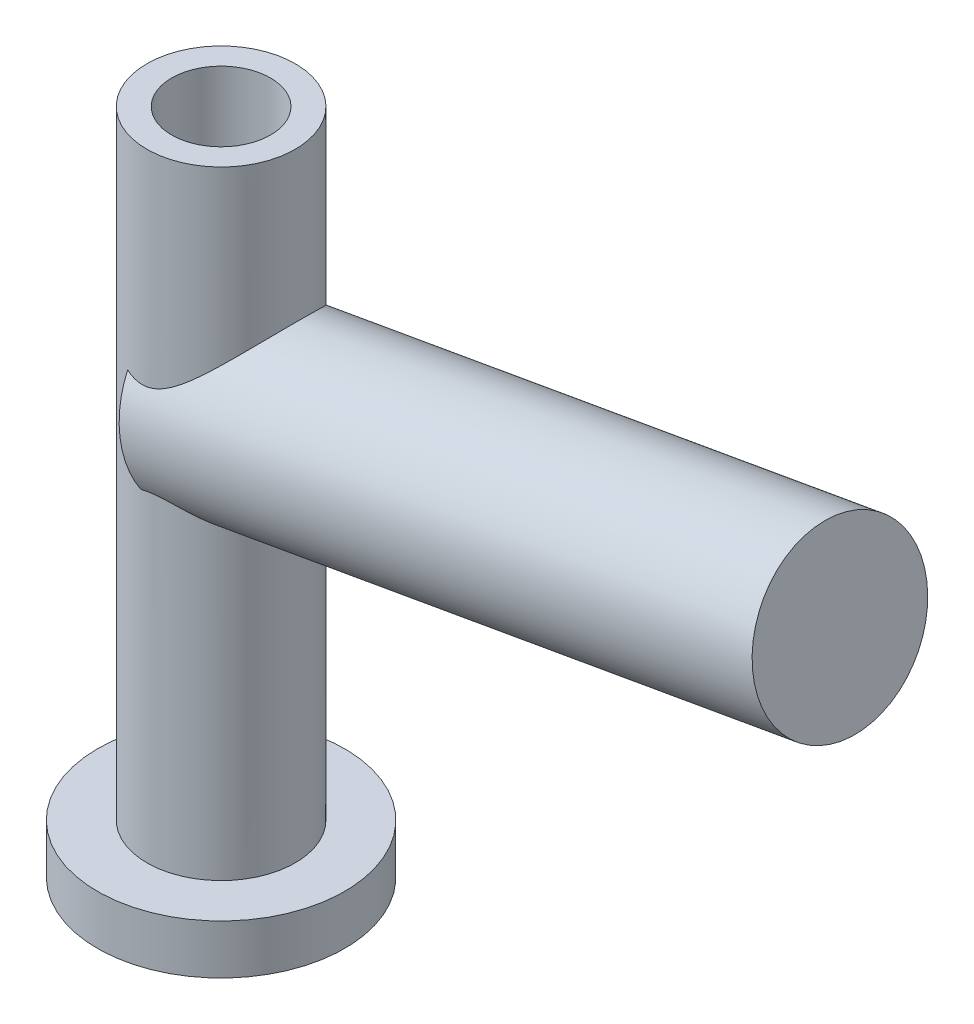
ISO-10303-21;
HEADER;
FILE_DESCRIPTION(('STEP AP214'),'2;1');
FILE_NAME('part.step','',(''),(''),'','','');
FILE_SCHEMA(('AUTOMOTIVE_DESIGN { 1 0 10303 214 1 1 1 1 }'));
ENDSEC;
DATA;
#1=APPLICATION_CONTEXT('core data for automotive mechanical design processes');
#2=APPLICATION_PROTOCOL_DEFINITION('international standard','automotive_design',2000,#1);
#3=PRODUCT_CONTEXT('',#1,'mechanical');
#4=PRODUCT('Part','Part','',(#3));
#5=PRODUCT_RELATED_PRODUCT_CATEGORY('part','',(#4));
#6=PRODUCT_DEFINITION_FORMATION('','',#4);
#7=PRODUCT_DEFINITION_CONTEXT('part definition',#1,'design');
#8=PRODUCT_DEFINITION('design','',#6,#7);
#9=PRODUCT_DEFINITION_SHAPE('','',#8);
#10=(LENGTH_UNIT() NAMED_UNIT(*) SI_UNIT(.MILLI.,.METRE.));
#11=(NAMED_UNIT(*) PLANE_ANGLE_UNIT() SI_UNIT($,.RADIAN.));
#12=(NAMED_UNIT(*) SI_UNIT($,.STERADIAN.) SOLID_ANGLE_UNIT());
#13=UNCERTAINTY_MEASURE_WITH_UNIT(LENGTH_MEASURE(1.E-05),#10,'distance_accuracy_value','');
#14=(GEOMETRIC_REPRESENTATION_CONTEXT(3) GLOBAL_UNCERTAINTY_ASSIGNED_CONTEXT((#13)) GLOBAL_UNIT_ASSIGNED_CONTEXT((#10,
#11,#12)) REPRESENTATION_CONTEXT('',''));
#15=CARTESIAN_POINT('',(0.,0.,0.));
#16=DIRECTION('',(0.,0.,1.));
#17=DIRECTION('',(1.,0.,0.));
#18=AXIS2_PLACEMENT_3D('',#15,#16,#17);
#19=CARTESIAN_POINT('',(0.,202.5,0.));
#20=DIRECTION('',(0.,1.,0.));
#21=DIRECTION('',(-1.,0.,0.));
#22=AXIS2_PLACEMENT_3D('',#19,#20,#21);
#23=CYLINDRICAL_SURFACE('',#22,45.);
#24=CARTESIAN_POINT('',(0.,-172.5,0.));
#25=DIRECTION('',(0.,1.,0.));
#26=DIRECTION('',(-1.,0.,0.));
#27=AXIS2_PLACEMENT_3D('',#24,#25,#26);
#28=CIRCLE('',#27,44.9999999999999);
#29=CARTESIAN_POINT('',(-44.9999999999999,-172.5,0.));
#30=VERTEX_POINT('',#29);
#31=EDGE_CURVE('E94',#30,#30,#28,.T.);
#32=ORIENTED_EDGE('',*,*,#31,.T.);
#33=EDGE_LOOP('',(#32));
#34=FACE_BOUND('',#33,.T.);
#35=CARTESIAN_POINT('',(0.,202.5,0.));
#36=DIRECTION('',(0.,1.,0.));
#37=DIRECTION('',(-1.,0.,0.));
#38=AXIS2_PLACEMENT_3D('',#35,#36,#37);
#39=CIRCLE('',#38,45.);
#40=CARTESIAN_POINT('',(-45.0000000000001,202.5,0.));
#41=VERTEX_POINT('',#40);
#42=EDGE_CURVE('E91',#41,#41,#39,.T.);
#43=ORIENTED_EDGE('',*,*,#42,.F.);
#44=EDGE_LOOP('',(#43));
#45=FACE_BOUND('',#44,.T.);
#46=CARTESIAN_POINT('',(0.,1.66533453693773E-13,0.));
#47=DIRECTION('',(0.984807753012208,0.173648177666931,0.));
#48=DIRECTION('',(-0.173648177666931,0.984807753012208,0.));
#49=AXIS2_PLACEMENT_3D('',#46,#47,#48);
#50=ELLIPSE('',#49,259.144671741463,45.);
#51=CARTESIAN_POINT('',(-13.8588079989624,78.5972058460888,42.8127719360455));
#52=VERTEX_POINT('',#51);
#53=CARTESIAN_POINT('',(-3.83948660651369,21.7748105881878,44.8359046144755));
#54=VERTEX_POINT('',#53);
#55=EDGE_CURVE('E11',#52,#54,#50,.T.);
#56=ORIENTED_EDGE('',*,*,#55,.F.);
#57=CARTESIAN_POINT('',(-13.8588079989624,78.5972058460888,-42.8127719360455));
#58=CARTESIAN_POINT('',(-13.5020682336849,78.494900262207,-42.928249213952));
#59=CARTESIAN_POINT('',(-13.1427838544446,78.3969039139421,-43.0396272165403));
#60=CARTESIAN_POINT('',(-12.4191677396781,78.2105091767803,-43.2539799090304));
#61=CARTESIAN_POINT('',(-12.0548349233566,78.1221128800589,-43.3569527659573));
#62=CARTESIAN_POINT('',(-10.9533860233819,77.8725920031187,-43.6531996481481));
#63=CARTESIAN_POINT('',(-10.2089635340595,77.7274697825979,-43.8334303837411));
#64=CARTESIAN_POINT('',(-8.70563043818808,77.4886584406251,-44.1565584695316));
#65=CARTESIAN_POINT('',(-7.94675649576806,77.3948534838856,-44.2995395155099));
#66=CARTESIAN_POINT('',(-6.4181033975828,77.2659595975164,-44.5466804427495));
#67=CARTESIAN_POINT('',(-5.64833170158054,77.2308322921113,-44.6508656621936));
#68=CARTESIAN_POINT('',(-4.09521830997738,77.2248373890262,-44.8201537138915));
#69=CARTESIAN_POINT('',(-3.31182211567425,77.2547095083745,-44.8847958157205));
#70=CARTESIAN_POINT('',(-1.74815759633799,77.3825180301158,-44.9728505219206));
#71=CARTESIAN_POINT('',(-0.967889715048915,77.4804637673907,-44.9962574701912));
#72=CARTESIAN_POINT('',(0.579748895131322,77.7421179422618,-45.0029055759001));
#73=CARTESIAN_POINT('',(1.34714533144246,77.9056733849828,-44.9862397304213));
#74=CARTESIAN_POINT('',(2.86472704055477,78.2928839673861,-44.9151514225604));
#75=CARTESIAN_POINT('',(3.61490985278453,78.5165476417603,-44.8607235966651));
#76=CARTESIAN_POINT('',(5.25874134194113,79.0717667837323,-44.7009072026467));
#77=CARTESIAN_POINT('',(6.1471593020175,79.4162560012047,-44.5868725427947));
#78=CARTESIAN_POINT('',(7.88940476648677,80.1678337010514,-44.3118050051057));
#79=CARTESIAN_POINT('',(8.74321987942773,80.5749443625335,-44.150755457436));
#80=CARTESIAN_POINT('',(10.4207895951294,81.4395676594922,-43.7852483242924));
#81=CARTESIAN_POINT('',(11.2443656365108,81.897330379869,-43.5805702730168));
#82=CARTESIAN_POINT('',(12.8588146478962,82.8493303466253,-43.1318088903923));
#83=CARTESIAN_POINT('',(13.6496875891803,83.3435676250357,-42.8877255244385));
#84=CARTESIAN_POINT('',(15.1208393520541,84.3060930621686,-42.3898449638157));
#85=CARTESIAN_POINT('',(15.8040830618424,84.7717588183598,-42.139678669748));
#86=CARTESIAN_POINT('',(17.1482724100704,85.7189677908687,-41.6107975611102));
#87=CARTESIAN_POINT('',(17.8092144509954,86.200513544273,-41.3320781695895));
#88=CARTESIAN_POINT('',(19.110644168935,87.1750592946884,-40.7466891192313));
#89=CARTESIAN_POINT('',(19.7511182531218,87.6680665427725,-40.4400013868663));
#90=CARTESIAN_POINT('',(21.0123712209768,88.6613186166643,-39.7992528837449));
#91=CARTESIAN_POINT('',(21.6331511275025,89.1615630646218,-39.4651935378286));
#92=CARTESIAN_POINT('',(22.8559109543137,90.1659501353751,-38.7698584215641));
#93=CARTESIAN_POINT('',(23.4578925210022,90.6700924119375,-38.4085850441951));
#94=CARTESIAN_POINT('',(24.6437141905706,91.6794129908616,-37.65872351715));
#95=CARTESIAN_POINT('',(25.2275539858396,92.1845913106358,-37.2701349046824));
#96=CARTESIAN_POINT('',(26.377146710015,93.1931434776089,-36.465574667989));
#97=CARTESIAN_POINT('',(26.9429069164054,93.6965179765615,-36.0496142732167));
#98=CARTESIAN_POINT('',(28.0565295379893,94.6991689964079,-35.1898550517585));
#99=CARTESIAN_POINT('',(28.604392457982,95.1984456325854,-34.7460570112758));
#100=CARTESIAN_POINT('',(30.0776834523337,96.554856399631,-33.493843727628));
#101=CARTESIAN_POINT('',(30.9850380286396,97.4056328288906,-32.6569264764343));
#102=CARTESIAN_POINT('',(32.7419342609837,99.0756260480037,-30.8952017555494));
#103=CARTESIAN_POINT('',(33.5914697282885,99.8948394554143,-29.970384902735));
#104=CARTESIAN_POINT('',(35.2252194313677,101.487274555471,-28.0318849073841));
#105=CARTESIAN_POINT('',(36.0095662807477,102.260588656695,-27.0183912394946));
#106=CARTESIAN_POINT('',(37.1316869914842,103.376274358493,-25.429469759152));
#107=CARTESIAN_POINT('',(37.4966187265667,103.740746206033,-24.8884538248923));
#108=CARTESIAN_POINT('',(38.2072492633795,104.45319956527,-23.7831433483793));
#109=CARTESIAN_POINT('',(38.5529436308132,104.801177272279,-23.2188434908547));
#110=CARTESIAN_POINT('',(39.3637987087387,105.620146253115,-21.8262324568388));
#111=CARTESIAN_POINT('',(39.818471696384,106.081733816894,-20.986190139631));
#112=CARTESIAN_POINT('',(40.6811760335722,106.960996837999,-19.2606322879171));
#113=CARTESIAN_POINT('',(41.0892201271086,107.378684291006,-18.3751292744757));
#114=CARTESIAN_POINT('',(41.85351511482,108.163542961546,-16.5605640866657));
#115=CARTESIAN_POINT('',(42.2097765846356,108.530724493152,-15.6315108580246));
#116=CARTESIAN_POINT('',(42.8651007807602,109.207841096581,-13.7328423825856));
#117=CARTESIAN_POINT('',(43.1641625433463,109.517775203876,-12.7632264527069));
#118=CARTESIAN_POINT('',(43.567024040915,109.93607832081,-11.2774952959307));
#119=CARTESIAN_POINT('',(43.6942448674269,110.068326392567,-10.7742562454642));
#120=CARTESIAN_POINT('',(43.9319861181545,110.315677146819,-9.75970692050896));
#121=CARTESIAN_POINT('',(44.0425086632686,110.430782006697,-9.24839768016573));
#122=CARTESIAN_POINT('',(44.2462481086925,110.643121029475,-8.21858338938728));
#123=CARTESIAN_POINT('',(44.3394622968489,110.740352391641,-7.70007722487925));
#124=CARTESIAN_POINT('',(44.5079983176441,110.91625229653,-6.65710712188265));
#125=CARTESIAN_POINT('',(44.5833226008365,110.994923381624,-6.13264400969958));
#126=CARTESIAN_POINT('',(44.7155680034601,111.133103733906,-5.07932000344115));
#127=CARTESIAN_POINT('',(44.7725037344155,111.192628214812,-4.55046294526577));
#128=CARTESIAN_POINT('',(44.8676771904522,111.292157330364,-3.48931091719044));
#129=CARTESIAN_POINT('',(44.9059174372741,111.332164597588,-2.9570164207686));
#130=CARTESIAN_POINT('',(44.9634513807731,111.392365565306,-1.89030740337745));
#131=CARTESIAN_POINT('',(44.9827462510667,111.412560493123,-1.35589301578935));
#132=CARTESIAN_POINT('',(45.0022685936579,111.432993889163,-0.2863930074936));
#133=CARTESIAN_POINT('',(45.0024968402736,111.433233167807,0.248692585073067));
#134=CARTESIAN_POINT('',(44.9773483616441,111.4069100325,1.69206689516315));
#135=CARTESIAN_POINT('',(44.9339656473947,111.361499890831,2.59983050773242));
#136=CARTESIAN_POINT('',(44.7929262377175,111.213974698375,4.40622919370734));
#137=CARTESIAN_POINT('',(44.6952760850919,111.111866483442,5.30486535427513));
#138=CARTESIAN_POINT('',(44.4475313358639,110.853104543688,7.08706287839397));
#139=CARTESIAN_POINT('',(44.2974270696419,110.696440761874,7.97062143095365));
#140=CARTESIAN_POINT('',(43.9473984204928,110.331679301118,9.71696670982498));
#141=CARTESIAN_POINT('',(43.7474714809924,110.123578982795,10.5797523677156));
#142=CARTESIAN_POINT('',(43.3018707096825,109.660672162236,12.2765823257607));
#143=CARTESIAN_POINT('',(43.056383050237,109.406055800001,13.1107277803011));
#144=CARTESIAN_POINT('',(42.5225673379333,108.853712756927,14.7504145231515));
#145=CARTESIAN_POINT('',(42.2342408368087,108.555987637609,15.5559568462318));
#146=CARTESIAN_POINT('',(41.6182287112753,107.921706780591,17.1359894201705));
#147=CARTESIAN_POINT('',(41.2905435156085,107.585151465878,17.9104800091588));
#148=CARTESIAN_POINT('',(40.5990947257264,106.877356754603,19.4269964556739));
#149=CARTESIAN_POINT('',(40.2353229760871,106.506109518905,20.1690149197695));
#150=CARTESIAN_POINT('',(39.5566951107476,105.816218930452,21.4634821583139));
#151=CARTESIAN_POINT('',(39.2481378059276,105.503426967961,22.0223882233962));
#152=CARTESIAN_POINT('',(38.6122257187577,104.860965902102,23.1192089106365));
#153=CARTESIAN_POINT('',(38.2848739307567,104.531299488084,23.6571268538251));
#154=CARTESIAN_POINT('',(37.276142923443,103.519256338515,25.2399546583479));
#155=CARTESIAN_POINT('',(36.5682585040065,102.814009508094,26.2536160622613));
#156=CARTESIAN_POINT('',(35.0885354906375,101.353779985247,28.2009879197055));
#157=CARTESIAN_POINT('',(34.3164977449614,100.59864403035,29.1344296071527));
#158=CARTESIAN_POINT('',(32.7168101713678,99.0523628899434,30.9200092780729));
#159=CARTESIAN_POINT('',(31.8891650101819,98.2612207279694,31.7721540697225));
#160=CARTESIAN_POINT('',(30.4741934920071,96.9284465199652,33.1198615272755));
#161=CARTESIAN_POINT('',(29.9013234009462,96.3938744988394,33.6378156592088));
#162=CARTESIAN_POINT('',(28.7340357766402,95.3167794667058,34.6402529581981));
#163=CARTESIAN_POINT('',(28.1396168579233,94.7742559458007,35.1247339672755));
#164=CARTESIAN_POINT('',(26.9293367382052,93.6840362020126,36.0610114461587));
#165=CARTESIAN_POINT('',(26.3134631475998,93.1363371279843,36.5127885506947));
#166=CARTESIAN_POINT('',(25.0606074920499,92.0392529752442,37.3837936836278));
#167=CARTESIAN_POINT('',(24.4236260546519,91.4898679470965,37.8030226784594));
#168=CARTESIAN_POINT('',(23.1292831399214,90.3937954310147,38.60850020169));
#169=CARTESIAN_POINT('',(22.4719600722843,89.8471048783786,38.9948062669067));
#170=CARTESIAN_POINT('',(21.1349700489864,88.7592097923245,39.7353381849555));
#171=CARTESIAN_POINT('',(20.4553016476076,88.2180056168445,40.0895619565102));
#172=CARTESIAN_POINT('',(19.0729570200041,87.1459975750392,40.7653498735562));
#173=CARTESIAN_POINT('',(18.3703005642071,86.6151853683677,41.0869411557644));
#174=CARTESIAN_POINT('',(16.9398406379851,85.5688789366,41.6970786084983));
#175=CARTESIAN_POINT('',(16.2120421647709,85.0533817049658,41.9856312971196));
#176=CARTESIAN_POINT('',(14.7836780844042,84.0812874804866,42.5085620883654));
#177=CARTESIAN_POINT('',(14.085054846232,83.6231487627994,42.7453649837528));
#178=CARTESIAN_POINT('',(12.6624425900561,82.7319172020672,43.1881638680371));
#179=CARTESIAN_POINT('',(11.9384548840863,82.2988230665979,43.3941614475121));
#180=CARTESIAN_POINT('',(10.4642545655225,81.4660338734019,43.7730262453964));
#181=CARTESIAN_POINT('',(9.7140771162511,81.0662963040516,43.9459360081503));
#182=CARTESIAN_POINT('',(8.18543009903242,80.3090599780138,44.2561481031419));
#183=CARTESIAN_POINT('',(7.40696516554731,79.9515543427185,44.3934562384287));
#184=CARTESIAN_POINT('',(5.95718952097239,79.3461500269658,44.6088926922437));
#185=CARTESIAN_POINT('',(5.29026370863918,79.0899580518596,44.6931214973658));
#186=CARTESIAN_POINT('',(3.93835210925277,78.6206853084625,44.8324762394336));
#187=CARTESIAN_POINT('',(3.25336818565341,78.4076001114244,44.887605167009));
#188=CARTESIAN_POINT('',(1.86941999553193,78.0311016726879,44.9664823515075));
#189=CARTESIAN_POINT('',(1.17048560990099,77.8675923381965,44.9902916183809));
#190=CARTESIAN_POINT('',(-0.238238220909128,77.594553235167,45.0048800011494));
#191=CARTESIAN_POINT('',(-0.948026976783535,77.4850200534396,44.9956612058833));
#192=CARTESIAN_POINT('',(-2.37572381693164,77.3221304235317,44.9429439002563));
#193=CARTESIAN_POINT('',(-3.09365320753649,77.2690048747573,44.8993057570348));
#194=CARTESIAN_POINT('',(-4.52854891616432,77.2193224628065,44.7773469168993));
#195=CARTESIAN_POINT('',(-5.24551512276337,77.2227716609699,44.6990225046212));
#196=CARTESIAN_POINT('',(-6.67426806344343,77.2830455478713,44.5081452148718));
#197=CARTESIAN_POINT('',(-7.38603806725268,77.3399993672516,44.3955099745342));
#198=CARTESIAN_POINT('',(-8.79780085607867,77.5020271933197,44.137440714273));
#199=CARTESIAN_POINT('',(-9.49779580081019,77.6070922737063,43.9920127810664));
#200=CARTESIAN_POINT('',(-10.8164573849662,77.8467366022686,43.6854399929805));
#201=CARTESIAN_POINT('',(-11.4364929235734,77.9775259774198,43.52713389473));
#202=CARTESIAN_POINT('',(-12.6596951501075,78.2673956720616,43.1871886137604));
#203=CARTESIAN_POINT('',(-13.2629343655775,78.4263208155804,43.005678858139));
#204=CARTESIAN_POINT('',(-13.8588079989627,78.597205846088,42.812771936046));
#205=B_SPLINE_CURVE_WITH_KNOTS('',3,(#57,#58,#59,#60,#61,#62,#63,#64,#65,#66,#67,#68,#69,#70,
#71,#72,#73,#74,#75,#76,#77,#78,#79,#80,#81,#82,#83,#84,#85,#86,#87,#88,#89,#90,#91,#92,#93,#94,
#95,#96,#97,#98,#99,#100,#101,#102,#103,#104,#105,#106,#107,#108,#109,#110,#111,#112,#113,#114,
#115,#116,#117,#118,#119,#120,#121,#122,#123,#124,#125,#126,#127,#128,#129,#130,#131,#132,#133,
#134,#135,#136,#137,#138,#139,#140,#141,#142,#143,#144,#145,#146,#147,#148,#149,#150,#151,#152,
#153,#154,#155,#156,#157,#158,#159,#160,#161,#162,#163,#164,#165,#166,#167,#168,#169,#170,#171,
#172,#173,#174,#175,#176,#177,#178,#179,#180,#181,#182,#183,#184,#185,#186,#187,#188,#189,#190,
#191,#192,#193,#194,#195,#196,#197,#198,#199,#200,#201,#202,#203,#204),.UNSPECIFIED.,.F.,.F.,(4,
2,2,2,2,2,2,2,2,2,2,2,2,2,2,2,2,2,2,2,2,2,2,2,2,2,2,2,2,2,2,2,2,2,2,2,2,2,2,2,2,2,2,2,2,2,2,2,2,
2,2,2,2,2,2,2,2,2,2,2,2,2,2,2,2,2,2,2,2,2,2,2,2,4),(0.,1.16590852209217,2.33207062727998,
4.66813141031856,6.99889715896348,9.32813796564165,11.6840248838672,14.0402349267771,
16.3909821837801,18.7420633969298,21.616422344217,24.4918016789177,27.3820708983176,
30.2723426558978,32.8629516916897,35.4539766437651,38.0466879797611,40.6392644367867,
43.2316131893535,45.8240058736754,48.4153415638251,51.0066041012291,55.5001076758494,
59.9940914637298,64.4786971508996,66.7204437451855,68.9627049494005,72.1425427424643,
75.3215093751554,78.499825847858,81.6781958653623,83.2846616646434,84.8909232500854,
86.4974363185743,88.1037292003239,89.7087425651641,91.3135393779898,92.9182367715733,
94.5228689964738,97.2489282091788,99.974658823402,102.700892175962,105.427265449772,
108.142734038737,110.858104290381,113.573444965652,116.289400701691,118.421417793272,
120.553096148076,124.81766048956,129.095996863698,133.373974635161,136.190979599836,
139.008166004859,141.827007157964,144.645764580618,147.459490302543,150.273398428999,
153.084947034798,155.895939998434,158.499894334607,161.103714173727,163.704163185246,
166.304188057906,168.460506212671,170.616602716833,172.768492946192,174.920247083021,
177.080775663786,179.241535722097,181.407524097116,183.573110769172,185.531314235007,
187.479036306389),.UNSPECIFIED.);
#206=CARTESIAN_POINT('',(-13.8588079989624,78.5972058460879,-42.8127719360461));
#207=VERTEX_POINT('',#206);
#208=EDGE_CURVE('E41',#207,#52,#205,.T.);
#209=ORIENTED_EDGE('',*,*,#208,.F.);
#210=CARTESIAN_POINT('',(-3.83948660651404,21.7748105881887,-44.8359046144761));
#211=VERTEX_POINT('',#210);
#212=EDGE_CURVE('E53',#211,#207,#50,.T.);
#213=ORIENTED_EDGE('',*,*,#212,.F.);
#214=CARTESIAN_POINT('',(-3.83948660651369,21.7748105881878,44.8359046144755));
#215=CARTESIAN_POINT('',(-3.51413088254018,21.8786279291037,44.8637664768579));
#216=CARTESIAN_POINT('',(-3.18685105346425,21.9772575572097,44.8882240043151));
#217=CARTESIAN_POINT('',(-2.52869118158819,22.1635459056473,44.9301069586854));
#218=CARTESIAN_POINT('',(-2.19781062958128,22.2512030517698,44.9475313773625));
#219=CARTESIAN_POINT('',(-1.20018327098262,22.496803753169,44.9889132079445));
#220=CARTESIAN_POINT('',(-0.528546355964259,22.6373457654691,45.0019708895382));
#221=CARTESIAN_POINT('',(0.816839783067104,22.8671339799317,44.9975675878702));
#222=CARTESIAN_POINT('',(1.49051003896321,22.9568491732892,44.98039184649));
#223=CARTESIAN_POINT('',(2.84105556046051,23.0854950700701,44.9153118302767));
#224=CARTESIAN_POINT('',(3.51792994086647,23.124439062023,44.8674156009263));
#225=CARTESIAN_POINT('',(4.87139141299724,23.1524701624869,44.7407273892346));
#226=CARTESIAN_POINT('',(5.54797397445266,23.141438213814,44.6618620377065));
#227=CARTESIAN_POINT('',(6.89450086518186,23.07232314949,44.4739041838536));
#228=CARTESIAN_POINT('',(7.56444430179819,23.0142337913792,44.3648076724397));
#229=CARTESIAN_POINT('',(8.8948859467259,22.8555275000829,44.1173399582555));
#230=CARTESIAN_POINT('',(9.55536636043097,22.7548391550669,43.9789197935151));
#231=CARTESIAN_POINT('',(10.8630203876249,22.516428961842,43.6743145031044));
#232=CARTESIAN_POINT('',(11.510192686078,22.3787034725732,43.5081266482473));
#233=CARTESIAN_POINT('',(13.1767900136001,21.9790156753973,43.0407862399344));
#234=CARTESIAN_POINT('',(14.1844972546716,21.6923061702986,42.7188169132164));
#235=CARTESIAN_POINT('',(16.1584587246669,21.059663636319,42.0119627615102));
#236=CARTESIAN_POINT('',(17.1246865648937,20.7136935849361,41.627038612886));
#237=CARTESIAN_POINT('',(19.0183354540631,19.9792514506313,40.7967563213791));
#238=CARTESIAN_POINT('',(19.945609370032,19.5906353124776,40.3511920428932));
#239=CARTESIAN_POINT('',(21.7582299083313,18.7863090436094,39.4033676354439));
#240=CARTESIAN_POINT('',(22.6435803869833,18.370601413294,38.9011127355967));
#241=CARTESIAN_POINT('',(24.0932468920639,17.6604266213622,38.0129728887469));
#242=CARTESIAN_POINT('',(24.6688353252158,17.3702008436304,37.6419449655964));
#243=CARTESIAN_POINT('',(25.8010741948308,16.7854486014566,36.875088208336));
#244=CARTESIAN_POINT('',(26.3577234955911,16.4909218806127,36.4792578909575));
#245=CARTESIAN_POINT('',(27.4520280448451,15.90014475968,35.6630364943083));
#246=CARTESIAN_POINT('',(27.9896785286274,15.6038939486003,35.2426393230905));
#247=CARTESIAN_POINT('',(29.0455508681312,15.0120698622929,34.3776350778657));
#248=CARTESIAN_POINT('',(29.56377098534,14.7164966499033,33.9330258461957));
#249=CARTESIAN_POINT('',(31.0870111418553,13.8349879811168,32.5646926590453));
#250=CARTESIAN_POINT('',(32.0625597099109,13.2531972285937,31.6050099412612));
#251=CARTESIAN_POINT('',(33.9289087380773,12.1164863644952,29.592425401104));
#252=CARTESIAN_POINT('',(34.8197331892032,11.561558668193,28.5395501317376));
#253=CARTESIAN_POINT('',(36.363878399943,10.5843944784813,26.5326799247218));
#254=CARTESIAN_POINT('',(37.0316720233317,10.1557719983713,25.5929157749896));
#255=CARTESIAN_POINT('',(38.2992554855453,9.33370551219905,23.6539253492922));
#256=CARTESIAN_POINT('',(38.8990510026173,8.94025856935077,22.6547040489949));
#257=CARTESIAN_POINT('',(40.024730350241,8.19584166174768,20.6007781141174));
#258=CARTESIAN_POINT('',(40.5506395371565,7.84485713048306,19.5460926853634));
#259=CARTESIAN_POINT('',(41.5227906947525,7.19199803009608,17.3856287740572));
#260=CARTESIAN_POINT('',(41.969032017189,6.89012386057825,16.2798498758583));
#261=CARTESIAN_POINT('',(42.5754871557399,6.47794885028374,14.5839837434103));
#262=CARTESIAN_POINT('',(42.7677852883454,6.3468954573739,14.0101632143757));
#263=CARTESIAN_POINT('',(43.1298631095991,6.09961059376558,12.8523385259758));
#264=CARTESIAN_POINT('',(43.2996455254641,5.9833773280447,12.268335609666));
#265=CARTESIAN_POINT('',(43.6160293021675,5.76639581146481,11.0911478881369));
#266=CARTESIAN_POINT('',(43.7626270523182,5.6656499726244,10.4979616685083));
#267=CARTESIAN_POINT('',(44.0319689688137,5.4802824157366,9.30377839387881));
#268=CARTESIAN_POINT('',(44.1547161993161,5.39565862646182,8.70278235283083));
#269=CARTESIAN_POINT('',(44.3757710113178,5.24308667399298,7.49452712591766));
#270=CARTESIAN_POINT('',(44.4740908991471,5.17513011418352,6.88727125496955));
#271=CARTESIAN_POINT('',(44.6459028218484,5.05627809965758,5.6676767406328));
#272=CARTESIAN_POINT('',(44.7193980054978,5.00538048118306,5.05533875196498));
#273=CARTESIAN_POINT('',(44.8412200120068,4.92096950874981,3.82698641275167));
#274=CARTESIAN_POINT('',(44.8895480372453,4.88745532428543,3.21097223926105));
#275=CARTESIAN_POINT('',(44.960808923065,4.83802442240257,1.97683597735373));
#276=CARTESIAN_POINT('',(44.9837426441499,4.82210710870193,1.35871396107476));
#277=CARTESIAN_POINT('',(45.0116257759143,4.80275857794709,-0.337200061091388));
#278=CARTESIAN_POINT('',(44.9906093007521,4.81735210598063,-1.41579504538794));
#279=CARTESIAN_POINT('',(44.8713842176861,4.90005572082919,-3.56638528020227));
#280=CARTESIAN_POINT('',(44.7731834334622,4.96816038356238,-4.63838118852735));
#281=CARTESIAN_POINT('',(44.5010794058279,5.15650003642763,-6.76802028624895));
#282=CARTESIAN_POINT('',(44.3271804057747,5.27673210449197,-7.82566427673364));
#283=CARTESIAN_POINT('',(43.9061303739554,5.56700647379423,-9.91927496963076));
#284=CARTESIAN_POINT('',(43.6589774980823,5.7370500289949,-10.9552411256182));
#285=CARTESIAN_POINT('',(43.1003413376507,6.11992086590074,-12.9784389318552));
#286=CARTESIAN_POINT('',(42.7902469371747,6.33182217417841,-13.9662312192013));
#287=CARTESIAN_POINT('',(42.106421377945,6.79688086781897,-15.9094396350047));
#288=CARTESIAN_POINT('',(41.7326919029929,7.05003716155598,-16.8648566193196));
#289=CARTESIAN_POINT('',(40.9254231043061,7.5936339194361,-18.7390199033075));
#290=CARTESIAN_POINT('',(40.4918843501284,7.88407402852791,-19.6577665520804));
#291=CARTESIAN_POINT('',(39.5688611948072,8.49797856655391,-21.4552122114523));
#292=CARTESIAN_POINT('',(39.07937353143,8.82144492104401,-22.3339088826599));
#293=CARTESIAN_POINT('',(37.9884303650232,9.53608829471627,-24.147991271198));
#294=CARTESIAN_POINT('',(37.3805729445175,9.93076811200631,-25.0781478137849));
#295=CARTESIAN_POINT('',(36.1046482336072,10.7492587569446,-26.8826284356478));
#296=CARTESIAN_POINT('',(35.4365765319315,11.1730717183333,-27.7569484163326));
#297=CARTESIAN_POINT('',(34.0435446075981,12.0436694277396,-29.4489321276644));
#298=CARTESIAN_POINT('',(33.3185117911879,12.4904832307229,-30.2665209757529));
#299=CARTESIAN_POINT('',(31.8156841090457,13.399545527389,-31.8425486069875));
#300=CARTESIAN_POINT('',(31.0378882708079,13.8617943054829,-32.6009862993302));
#301=CARTESIAN_POINT('',(29.76094370402,14.6031081387151,-33.7593851049441));
#302=CARTESIAN_POINT('',(29.2780455867582,14.8797116671869,-34.1790126684417));
#303=CARTESIAN_POINT('',(28.2951356774242,15.4338479654467,-34.9970583324811));
#304=CARTESIAN_POINT('',(27.7951248488817,15.7113806821256,-35.3954776239357));
#305=CARTESIAN_POINT('',(26.7780397198228,16.2656102021039,-36.1710628059896));
#306=CARTESIAN_POINT('',(26.2609581857794,16.5423065953756,-36.548219498648));
#307=CARTESIAN_POINT('',(25.2101311273497,17.0926301634837,-37.2808192660873));
#308=CARTESIAN_POINT('',(24.676387249093,17.3662576379014,-37.6362644756257));
#309=CARTESIAN_POINT('',(23.592558018636,17.9079638884216,-38.3249685507169));
#310=CARTESIAN_POINT('',(23.0424827452643,18.1760459203716,-38.6582407049012));
#311=CARTESIAN_POINT('',(21.9256040517878,18.7041850303119,-39.3024620229164));
#312=CARTESIAN_POINT('',(21.3587999035148,18.9642417579689,-39.6134102130099));
#313=CARTESIAN_POINT('',(20.208691229748,19.4731183484255,-40.2122979331267));
#314=CARTESIAN_POINT('',(19.625396404777,19.7219446026412,-40.5002506238713));
#315=CARTESIAN_POINT('',(18.4419501408801,20.2049479491054,-41.0526593609008));
#316=CARTESIAN_POINT('',(17.8418011194719,20.4391271268946,-41.3171187545698));
#317=CARTESIAN_POINT('',(16.5326962337838,20.9227014548801,-41.8598239277664));
#318=CARTESIAN_POINT('',(15.8209749080759,21.1690697526422,-42.1341394372339));
#319=CARTESIAN_POINT('',(14.3752559307622,21.6297935628137,-42.6490407528626));
#320=CARTESIAN_POINT('',(13.6412599676655,21.8441514944829,-42.8896291079497));
#321=CARTESIAN_POINT('',(12.1538530741135,22.2320339075937,-43.3345678890217));
#322=CARTESIAN_POINT('',(11.4004975734684,22.4056630882802,-43.5390108908024));
#323=CARTESIAN_POINT('',(9.874908240862,22.7037332842986,-43.9101578166228));
#324=CARTESIAN_POINT('',(9.10267821889409,22.8281841410561,-44.0768692885323));
#325=CARTESIAN_POINT('',(7.6597575030106,23.0047693736004,-44.3484365037534));
#326=CARTESIAN_POINT('',(6.99109225558679,23.0649188537259,-44.4588085844937));
#327=CARTESIAN_POINT('',(5.64685261503083,23.1384760790403,-44.6494533751261));
#328=CARTESIAN_POINT('',(4.97127852637015,23.1518858752125,-44.7297274056122));
#329=CARTESIAN_POINT('',(3.61800996057626,23.128795993107,-44.8594690596728));
#330=CARTESIAN_POINT('',(2.94031559872771,23.0922989829042,-44.9089383298991));
#331=CARTESIAN_POINT('',(1.58825210393526,22.968451002712,-44.9770565443697));
#332=CARTESIAN_POINT('',(0.913882094330411,22.8811142527286,-44.9957141011325));
#333=CARTESIAN_POINT('',(-0.449054415232901,22.6532493608436,-45.0030882465328));
#334=CARTESIAN_POINT('',(-1.13734859010227,22.511051018021,-44.9907898925587));
#335=CARTESIAN_POINT('',(-2.15920299323935,22.2612588028795,-44.9494616794744));
#336=CARTESIAN_POINT('',(-2.49787087185529,22.1719721816427,-44.9318883151222));
#337=CARTESIAN_POINT('',(-3.17152637963366,21.9818726544293,-44.8893671581607));
#338=CARTESIAN_POINT('',(-3.50651366485103,21.8810586811158,-44.8644186823377));
#339=CARTESIAN_POINT('',(-3.83948660651385,21.7748105881887,-44.8359046144761));
#340=B_SPLINE_CURVE_WITH_KNOTS('',3,(#214,#215,#216,#217,#218,#219,#220,#221,#222,#223,#224,
#225,#226,#227,#228,#229,#230,#231,#232,#233,#234,#235,#236,#237,#238,#239,#240,#241,#242,#243,
#244,#245,#246,#247,#248,#249,#250,#251,#252,#253,#254,#255,#256,#257,#258,#259,#260,#261,#262,
#263,#264,#265,#266,#267,#268,#269,#270,#271,#272,#273,#274,#275,#276,#277,#278,#279,#280,#281,
#282,#283,#284,#285,#286,#287,#288,#289,#290,#291,#292,#293,#294,#295,#296,#297,#298,#299,#300,
#301,#302,#303,#304,#305,#306,#307,#308,#309,#310,#311,#312,#313,#314,#315,#316,#317,#318,#319,
#320,#321,#322,#323,#324,#325,#326,#327,#328,#329,#330,#331,#332,#333,#334,#335,#336,#337,#338,
#339),.UNSPECIFIED.,.F.,.F.,(4,2,2,2,2,2,2,2,2,2,2,2,2,2,2,2,2,2,2,2,2,2,2,2,2,2,2,2,2,2,2,2,2,
2,2,2,2,2,2,2,2,2,2,2,2,2,2,2,2,2,2,2,2,2,2,2,2,2,2,2,2,2,4),(0.,1.02784051402321,
2.05582832252131,4.11210538758723,6.14908603740079,8.18553343382229,10.2268347863863,
12.2684069746959,14.3134152475892,16.3586246353706,19.6414318299061,22.926297459783,
26.2226221158654,29.5186429686068,31.7493403573326,33.9801712770083,36.2115577522619,
38.4431434044493,42.8983761006139,47.352343445274,51.0387090591329,54.7247666123989,
58.4095560755545,62.0943755198558,63.9514581523494,65.8083156398148,67.665462022736,
69.5223696537438,71.3783398815783,73.2340746087715,75.0897206687786,76.9453038470048,
80.1775530279737,83.4094746187555,86.6412150634993,89.8730368716128,93.0400735677749,
96.2070264762934,99.3739492283672,102.541056729656,106.075147295801,109.609496978602,
113.148426431007,116.687421129196,118.777910569832,120.868282498659,122.959551865581,
125.05061527868,127.140413983312,129.230303786468,131.318988807543,133.407375748591,
135.810542026016,138.213526586394,140.610264516219,143.006522574521,145.04554208974,
147.084472129662,149.123293170326,151.161544221329,153.267487260885,154.319287202509,
155.371184611048),.UNSPECIFIED.);
#341=EDGE_CURVE('E63',#54,#211,#340,.T.);
#342=ORIENTED_EDGE('',*,*,#341,.F.);
#343=EDGE_LOOP('',(#56,#209,#213,#342));
#344=FACE_BOUND('',#343,.T.);
#345=ADVANCED_FACE('F37',(#34,#45,#344),#23,.T.);
#346=CARTESIAN_POINT('',(0.,202.5,0.));
#347=DIRECTION('',(0.,1.,0.));
#348=DIRECTION('',(-1.,0.,0.));
#349=AXIS2_PLACEMENT_3D('',#346,#347,#348);
#350=CYLINDRICAL_SURFACE('',#349,75.);
#351=CARTESIAN_POINT('',(0.,-172.5,0.));
#352=DIRECTION('',(0.,1.,0.));
#353=DIRECTION('',(-1.,0.,0.));
#354=AXIS2_PLACEMENT_3D('',#351,#352,#353);
#355=CIRCLE('',#354,75.);
#356=CARTESIAN_POINT('',(-75.,-172.5,0.));
#357=VERTEX_POINT('',#356);
#358=EDGE_CURVE('E76',#357,#357,#355,.T.);
#359=ORIENTED_EDGE('',*,*,#358,.F.);
#360=EDGE_LOOP('',(#359));
#361=FACE_BOUND('',#360,.T.);
#362=CARTESIAN_POINT('',(0.,-202.5,0.));
#363=DIRECTION('',(0.,1.,0.));
#364=DIRECTION('',(-1.,0.,0.));
#365=AXIS2_PLACEMENT_3D('',#362,#363,#364);
#366=CIRCLE('',#365,75.);
#367=CARTESIAN_POINT('',(-75.,-202.5,0.));
#368=VERTEX_POINT('',#367);
#369=EDGE_CURVE('E88',#368,#368,#366,.T.);
#370=ORIENTED_EDGE('',*,*,#369,.T.);
#371=EDGE_LOOP('',(#370));
#372=FACE_BOUND('',#371,.T.);
#373=ADVANCED_FACE('F39',(#361,#372),#350,.T.);
#374=CARTESIAN_POINT('',(75.,-172.5,0.));
#375=DIRECTION('',(0.,-1.,0.));
#376=DIRECTION('',(1.,0.,0.));
#377=AXIS2_PLACEMENT_3D('',#374,#375,#376);
#378=PLANE('',#377);
#379=ORIENTED_EDGE('',*,*,#31,.F.);
#380=EDGE_LOOP('',(#379));
#381=FACE_BOUND('',#380,.T.);
#382=ORIENTED_EDGE('',*,*,#358,.T.);
#383=EDGE_LOOP('',(#382));
#384=FACE_BOUND('',#383,.T.);
#385=ADVANCED_FACE('F117',(#381,#384),#378,.F.);
#386=CARTESIAN_POINT('',(44.9999999999999,202.5,0.));
#387=DIRECTION('',(0.,-1.,0.));
#388=DIRECTION('',(1.,0.,0.));
#389=AXIS2_PLACEMENT_3D('',#386,#387,#388);
#390=PLANE('',#389);
#391=CARTESIAN_POINT('',(0.,202.5,0.));
#392=DIRECTION('',(0.,1.,0.));
#393=DIRECTION('',(-1.,0.,0.));
#394=AXIS2_PLACEMENT_3D('',#391,#392,#393);
#395=CIRCLE('',#394,30.);
#396=CARTESIAN_POINT('',(-30.0000000000001,202.5,0.));
#397=VERTEX_POINT('',#396);
#398=EDGE_CURVE('E83',#397,#397,#395,.T.);
#399=ORIENTED_EDGE('',*,*,#398,.F.);
#400=EDGE_LOOP('',(#399));
#401=FACE_BOUND('',#400,.T.);
#402=ORIENTED_EDGE('',*,*,#42,.T.);
#403=EDGE_LOOP('',(#402));
#404=FACE_BOUND('',#403,.T.);
#405=ADVANCED_FACE('F114',(#401,#404),#390,.F.);
#406=CARTESIAN_POINT('',(0.,-202.5,0.));
#407=DIRECTION('',(0.,1.,0.));
#408=DIRECTION('',(-1.,0.,0.));
#409=AXIS2_PLACEMENT_3D('',#406,#407,#408);
#410=PLANE('',#409);
#411=CARTESIAN_POINT('',(0.,-202.5,0.));
#412=DIRECTION('',(0.,1.,0.));
#413=DIRECTION('',(-1.,0.,0.));
#414=AXIS2_PLACEMENT_3D('',#411,#412,#413);
#415=CIRCLE('',#414,30.);
#416=CARTESIAN_POINT('',(-29.9999999999999,-202.5,0.));
#417=VERTEX_POINT('',#416);
#418=EDGE_CURVE('E79',#417,#417,#415,.T.);
#419=ORIENTED_EDGE('',*,*,#418,.T.);
#420=EDGE_LOOP('',(#419));
#421=FACE_BOUND('',#420,.T.);
#422=ORIENTED_EDGE('',*,*,#369,.F.);
#423=EDGE_LOOP('',(#422));
#424=FACE_BOUND('',#423,.T.);
#425=ADVANCED_FACE('F109',(#421,#424),#410,.F.);
#426=CARTESIAN_POINT('',(375.492710813077,116.395504192845,0.));
#427=DIRECTION('',(-0.984807753012208,-0.173648177666931,0.));
#428=DIRECTION('',(0.173648177666931,-0.984807753012208,0.));
#429=AXIS2_PLACEMENT_3D('',#426,#427,#428);
#430=CYLINDRICAL_SURFACE('',#429,52.5);
#431=CARTESIAN_POINT('',(375.492710813077,116.395504192845,0.));
#432=DIRECTION('',(0.984807753012208,0.173648177666931,0.));
#433=DIRECTION('',(-0.173648177666931,0.984807753012208,0.));
#434=AXIS2_PLACEMENT_3D('',#431,#432,#433);
#435=CIRCLE('',#434,52.5);
#436=CARTESIAN_POINT('',(366.376181485563,168.097911225986,0.));
#437=VERTEX_POINT('',#436);
#438=EDGE_CURVE('E81',#437,#437,#435,.T.);
#439=ORIENTED_EDGE('',*,*,#438,.F.);
#440=EDGE_LOOP('',(#439));
#441=FACE_BOUND('',#440,.T.);
#442=CARTESIAN_POINT('',(-8.58231286168444,48.6727149027421,0.));
#443=DIRECTION('',(0.984807753012208,0.173648177666931,0.));
#444=DIRECTION('',(-0.173648177666931,0.984807753012208,0.));
#445=AXIS2_PLACEMENT_3D('',#442,#443,#444);
#446=CIRCLE('',#445,52.5);
#447=EDGE_CURVE('E75',#211,#207,#446,.T.);
#448=ORIENTED_EDGE('',*,*,#447,.T.);
#449=ORIENTED_EDGE('',*,*,#208,.T.);
#450=EDGE_CURVE('E78',#52,#54,#446,.T.);
#451=ORIENTED_EDGE('',*,*,#450,.T.);
#452=ORIENTED_EDGE('',*,*,#341,.T.);
#453=EDGE_LOOP('',(#448,#449,#451,#452));
#454=FACE_BOUND('',#453,.T.);
#455=ADVANCED_FACE('F77',(#441,#454),#430,.T.);
#456=CARTESIAN_POINT('',(-8.58231286168444,48.6727149027421,0.));
#457=DIRECTION('',(0.984807753012208,0.173648177666931,0.));
#458=DIRECTION('',(-0.173648177666931,0.984807753012208,0.));
#459=AXIS2_PLACEMENT_3D('',#456,#457,#458);
#460=PLANE('',#459);
#461=ORIENTED_EDGE('',*,*,#450,.F.);
#462=ORIENTED_EDGE('',*,*,#55,.T.);
#463=EDGE_LOOP('',(#461,#462));
#464=FACE_BOUND('',#463,.T.);
#465=ADVANCED_FACE('F108',(#464),#460,.F.);
#466=CARTESIAN_POINT('',(375.492710813077,116.395504192845,0.));
#467=DIRECTION('',(0.984807753012208,0.173648177666931,0.));
#468=DIRECTION('',(-0.173648177666931,0.984807753012208,0.));
#469=AXIS2_PLACEMENT_3D('',#466,#467,#468);
#470=PLANE('',#469);
#471=ORIENTED_EDGE('',*,*,#438,.T.);
#472=EDGE_LOOP('',(#471));
#473=FACE_BOUND('',#472,.T.);
#474=ADVANCED_FACE('F168',(#473),#470,.T.);
#475=ORIENTED_EDGE('',*,*,#447,.F.);
#476=ORIENTED_EDGE('',*,*,#212,.T.);
#477=EDGE_LOOP('',(#475,#476));
#478=FACE_BOUND('',#477,.T.);
#479=ADVANCED_FACE('F74',(#478),#460,.F.);
#480=CARTESIAN_POINT('',(0.,-202.5,0.));
#481=DIRECTION('',(0.,1.,0.));
#482=DIRECTION('',(-1.,0.,0.));
#483=AXIS2_PLACEMENT_3D('',#480,#481,#482);
#484=CYLINDRICAL_SURFACE('',#483,30.);
#485=CARTESIAN_POINT('',(-29.9999999999999,-202.5,0.));
#486=CARTESIAN_POINT('',(-29.9999999999999,-198.28125,0.));
#487=CARTESIAN_POINT('',(-29.9999999999999,-194.0625,0.));
#488=CARTESIAN_POINT('',(-29.9999999999999,-185.625,0.));
#489=CARTESIAN_POINT('',(-29.9999999999999,-181.40625,0.));
#490=CARTESIAN_POINT('',(-29.9999999999999,-172.96875,0.));
#491=CARTESIAN_POINT('',(-29.9999999999999,-168.75,0.));
#492=CARTESIAN_POINT('',(-29.9999999999999,-160.3125,0.));
#493=CARTESIAN_POINT('',(-29.9999999999999,-156.09375,0.));
#494=CARTESIAN_POINT('',(-30.,-147.65625,0.));
#495=CARTESIAN_POINT('',(-30.,-143.4375,0.));
#496=CARTESIAN_POINT('',(-30.,-135.,0.));
#497=CARTESIAN_POINT('',(-30.,-130.78125,0.));
#498=CARTESIAN_POINT('',(-30.,-122.34375,0.));
#499=CARTESIAN_POINT('',(-30.,-118.125,0.));
#500=CARTESIAN_POINT('',(-30.,-109.6875,0.));
#501=CARTESIAN_POINT('',(-30.,-105.46875,0.));
#502=CARTESIAN_POINT('',(-30.,-97.0312500000001,0.));
#503=CARTESIAN_POINT('',(-30.,-92.8125000000001,0.));
#504=CARTESIAN_POINT('',(-30.,-84.3750000000001,0.));
#505=CARTESIAN_POINT('',(-30.,-80.1562500000001,0.));
#506=CARTESIAN_POINT('',(-30.,-71.7187500000001,0.));
#507=CARTESIAN_POINT('',(-30.,-67.5000000000001,0.));
#508=CARTESIAN_POINT('',(-30.,-59.0625000000001,0.));
#509=CARTESIAN_POINT('',(-30.,-54.8437500000001,0.));
#510=CARTESIAN_POINT('',(-30.,-46.4062500000001,0.));
#511=CARTESIAN_POINT('',(-30.,-42.1875000000001,0.));
#512=CARTESIAN_POINT('',(-30.,-33.7500000000001,0.));
#513=CARTESIAN_POINT('',(-30.,-29.5312500000001,0.));
#514=CARTESIAN_POINT('',(-30.,-21.0937500000001,0.));
#515=CARTESIAN_POINT('',(-30.,-16.8750000000001,0.));
#516=CARTESIAN_POINT('',(-30.,-8.43750000000012,0.));
#517=CARTESIAN_POINT('',(-30.,-4.21875000000011,0.));
#518=CARTESIAN_POINT('',(-30.,4.21874999999989,0.));
#519=CARTESIAN_POINT('',(-30.,8.43749999999989,0.));
#520=CARTESIAN_POINT('',(-30.,16.8749999999999,0.));
#521=CARTESIAN_POINT('',(-30.,21.0937499999999,0.));
#522=CARTESIAN_POINT('',(-30.,29.5312499999999,0.));
#523=CARTESIAN_POINT('',(-30.,33.7499999999999,0.));
#524=CARTESIAN_POINT('',(-30.,42.1874999999999,0.));
#525=CARTESIAN_POINT('',(-30.,46.4062499999999,0.));
#526=CARTESIAN_POINT('',(-30.,54.8437499999999,0.));
#527=CARTESIAN_POINT('',(-30.,59.0624999999999,0.));
#528=CARTESIAN_POINT('',(-30.,67.4999999999999,0.));
#529=CARTESIAN_POINT('',(-30.,71.7187499999999,0.));
#530=CARTESIAN_POINT('',(-30.,80.1562499999999,0.));
#531=CARTESIAN_POINT('',(-30.,84.3749999999999,0.));
#532=CARTESIAN_POINT('',(-30.,92.8124999999999,0.));
#533=CARTESIAN_POINT('',(-30.,97.0312499999999,0.));
#534=CARTESIAN_POINT('',(-30.,105.46875,0.));
#535=CARTESIAN_POINT('',(-30.,109.6875,0.));
#536=CARTESIAN_POINT('',(-30.,118.125,0.));
#537=CARTESIAN_POINT('',(-30.,122.34375,0.));
#538=CARTESIAN_POINT('',(-30.,130.78125,0.));
#539=CARTESIAN_POINT('',(-30.,135.,0.));
#540=CARTESIAN_POINT('',(-30.,143.4375,0.));
#541=CARTESIAN_POINT('',(-30.,147.65625,0.));
#542=CARTESIAN_POINT('',(-30.,156.09375,0.));
#543=CARTESIAN_POINT('',(-30.,160.3125,0.));
#544=CARTESIAN_POINT('',(-30.,168.75,0.));
#545=CARTESIAN_POINT('',(-30.,172.96875,0.));
#546=CARTESIAN_POINT('',(-30.0000000000001,181.40625,0.));
#547=CARTESIAN_POINT('',(-30.0000000000001,185.625,0.));
#548=CARTESIAN_POINT('',(-30.0000000000001,194.0625,0.));
#549=CARTESIAN_POINT('',(-30.0000000000001,198.28125,0.));
#550=CARTESIAN_POINT('',(-30.0000000000001,202.5,0.));
#551=B_SPLINE_CURVE_WITH_KNOTS('',3,(#485,#486,#487,#488,#489,#490,#491,#492,#493,#494,#495,
#496,#497,#498,#499,#500,#501,#502,#503,#504,#505,#506,#507,#508,#509,#510,#511,#512,#513,#514,
#515,#516,#517,#518,#519,#520,#521,#522,#523,#524,#525,#526,#527,#528,#529,#530,#531,#532,#533,
#534,#535,#536,#537,#538,#539,#540,#541,#542,#543,#544,#545,#546,#547,#548,#549,#550),
.UNSPECIFIED.,.F.,.F.,(4,2,2,2,2,2,2,2,2,2,2,2,2,2,2,2,2,2,2,2,2,2,2,2,2,2,2,2,2,2,2,2,4),(0.,
12.65625,25.3125,37.96875,50.625,63.28125,75.9375,88.59375,101.25,113.90625,126.5625,139.21875,
151.875,164.53125,177.1875,189.84375,202.5,215.15625,227.8125,240.46875,253.125,265.78125,
278.4375,291.09375,303.75,316.40625,329.0625,341.71875,354.375,367.03125,379.6875,392.34375,
405.),.UNSPECIFIED.);
#552=EDGE_CURVE('BSEAM186',#417,#397,#551,.T.);
#553=ORIENTED_EDGE('',*,*,#418,.F.);
#554=ORIENTED_EDGE('',*,*,#398,.T.);
#555=ORIENTED_EDGE('',*,*,#552,.T.);
#556=ORIENTED_EDGE('',*,*,#552,.F.);
#557=EDGE_LOOP('',(#553,#555,#554,#556));
#558=FACE_BOUND('',#557,.T.);
#559=ADVANCED_FACE('F186',(#558),#484,.F.);
#560=CLOSED_SHELL('',(#345,#373,#385,#405,#425,#455,#465,#474,#479,#559));
#561=MANIFOLD_SOLID_BREP('B2',#560);
#562=ADVANCED_BREP_SHAPE_REPRESENTATION('',(#18,#561),#14);
#563=SHAPE_DEFINITION_REPRESENTATION(#9,#562);
ENDSEC;
END-ISO-10303-21;
